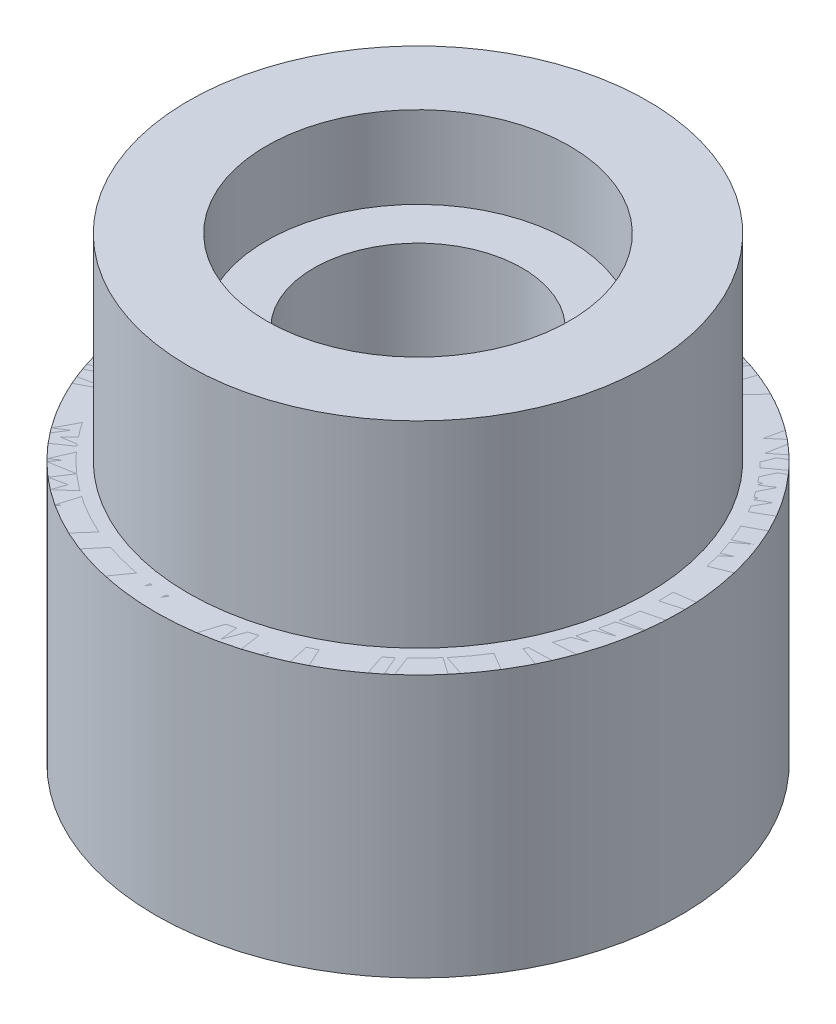
ISO-10303-21;
HEADER;
FILE_DESCRIPTION(('STEP AP214'),'2;1');
FILE_NAME('part.step','',(''),(''),'','','');
FILE_SCHEMA(('AUTOMOTIVE_DESIGN { 1 0 10303 214 1 1 1 1 }'));
ENDSEC;
DATA;
#1=APPLICATION_CONTEXT('core data for automotive mechanical design processes');
#2=APPLICATION_PROTOCOL_DEFINITION('international standard','automotive_design',2000,#1);
#3=PRODUCT_CONTEXT('',#1,'mechanical');
#4=PRODUCT('Part','Part','',(#3));
#5=PRODUCT_RELATED_PRODUCT_CATEGORY('part','',(#4));
#6=PRODUCT_DEFINITION_FORMATION('','',#4);
#7=PRODUCT_DEFINITION_CONTEXT('part definition',#1,'design');
#8=PRODUCT_DEFINITION('design','',#6,#7);
#9=PRODUCT_DEFINITION_SHAPE('','',#8);
#10=(LENGTH_UNIT() NAMED_UNIT(*) SI_UNIT(.MILLI.,.METRE.));
#11=(NAMED_UNIT(*) PLANE_ANGLE_UNIT() SI_UNIT($,.RADIAN.));
#12=(NAMED_UNIT(*) SI_UNIT($,.STERADIAN.) SOLID_ANGLE_UNIT());
#13=UNCERTAINTY_MEASURE_WITH_UNIT(LENGTH_MEASURE(1.E-05),#10,'distance_accuracy_value','');
#14=(GEOMETRIC_REPRESENTATION_CONTEXT(3) GLOBAL_UNCERTAINTY_ASSIGNED_CONTEXT((#13)) GLOBAL_UNIT_ASSIGNED_CONTEXT((#10,
#11,#12)) REPRESENTATION_CONTEXT('',''));
#15=CARTESIAN_POINT('',(0.,0.,0.));
#16=DIRECTION('',(0.,0.,1.));
#17=DIRECTION('',(1.,0.,0.));
#18=AXIS2_PLACEMENT_3D('',#15,#16,#17);
#19=CARTESIAN_POINT('',(0.,0.,0.));
#20=DIRECTION('',(0.,-1.,0.));
#21=DIRECTION('',(0.,0.,-1.));
#22=AXIS2_PLACEMENT_3D('',#19,#20,#21);
#23=CYLINDRICAL_SURFACE('',#22,7.375);
#24=CARTESIAN_POINT('',(0.,8.,0.));
#25=DIRECTION('',(0.,-1.,0.));
#26=DIRECTION('',(0.,0.,-1.));
#27=AXIS2_PLACEMENT_3D('',#24,#25,#26);
#28=CIRCLE('',#27,7.375);
#29=CARTESIAN_POINT('',(0.,8.,-7.375));
#30=VERTEX_POINT('',#29);
#31=EDGE_CURVE('P0_E21',#30,#30,#28,.T.);
#32=ORIENTED_EDGE('',*,*,#31,.T.);
#33=EDGE_LOOP('',(#32));
#34=FACE_BOUND('',#33,.T.);
#35=CARTESIAN_POINT('',(0.,0.,0.));
#36=DIRECTION('',(0.,-1.,0.));
#37=DIRECTION('',(0.,0.,-1.));
#38=AXIS2_PLACEMENT_3D('',#35,#36,#37);
#39=CIRCLE('',#38,7.375);
#40=CARTESIAN_POINT('',(0.,0.,-7.375));
#41=VERTEX_POINT('',#40);
#42=EDGE_CURVE('P0_E11',#41,#41,#39,.F.);
#43=ORIENTED_EDGE('',*,*,#42,.T.);
#44=EDGE_LOOP('',(#43));
#45=FACE_BOUND('',#44,.T.);
#46=ADVANCED_FACE('P0_F17',(#34,#45),#23,.T.);
#47=CARTESIAN_POINT('',(0.,8.,0.));
#48=DIRECTION('',(0.,-1.,0.));
#49=DIRECTION('',(0.,0.,-1.));
#50=AXIS2_PLACEMENT_3D('',#47,#48,#49);
#51=PLANE('',#50);
#52=ORIENTED_EDGE('',*,*,#31,.F.);
#53=EDGE_LOOP('',(#52));
#54=FACE_BOUND('',#53,.T.);
#55=CARTESIAN_POINT('',(-8.,8.,0.));
#56=CARTESIAN_POINT('',(-7.99990265013749,8.,-0.734238479496044));
#57=CARTESIAN_POINT('',(-7.8664429473326,8.,-1.45570441929716));
#58=CARTESIAN_POINT('',(-7.72495795081887,8.,-2.22055406179003));
#59=CARTESIAN_POINT('',(-7.43830640849944,8.,-2.94475767649498));
#60=CARTESIAN_POINT('',(-7.14001112713963,8.,-3.69837832427605));
#61=CARTESIAN_POINT('',(-6.69596408974921,8.,-4.37767802708114));
#62=CARTESIAN_POINT('',(-6.24297994954599,8.,-5.07064964023238));
#63=CARTESIAN_POINT('',(-5.65685424949238,8.,-5.65685424949238));
#64=CARTESIAN_POINT('',(-5.07148593780608,8.,-6.24230136841904));
#65=CARTESIAN_POINT('',(-4.37767802708114,8.,-6.69596408974921));
#66=CARTESIAN_POINT('',(-3.69931538180431,8.,-7.1395275587553));
#67=CARTESIAN_POINT('',(-2.94475767649498,8.,-7.43830640849944));
#68=CARTESIAN_POINT('',(-2.22156295997012,8.,-7.72466659543274));
#69=CARTESIAN_POINT('',(-1.45570441929716,8.,-7.8664429473326));
#70=CARTESIAN_POINT('',(-0.734508562176014,8.,-7.99995130716374));
#71=CARTESIAN_POINT('',(0.,8.,-8.));
#72=CARTESIAN_POINT('',(0.733449371100174,8.,-8.00004862261922));
#73=CARTESIAN_POINT('',(1.45570441929716,8.,-7.86644294733259));
#74=CARTESIAN_POINT('',(2.22055406180139,8.,-7.72495795081425));
#75=CARTESIAN_POINT('',(2.94475767649498,8.,-7.43830640849944));
#76=CARTESIAN_POINT('',(3.69837832427386,8.,-7.14001112714063));
#77=CARTESIAN_POINT('',(4.37767802708114,8.,-6.69596408974921));
#78=CARTESIAN_POINT('',(5.07064964023111,8.,-6.24297994954726));
#79=CARTESIAN_POINT('',(5.65685424949238,8.,-5.65685424949238));
#80=CARTESIAN_POINT('',(6.24230136841836,8.,-5.07148593780675));
#81=CARTESIAN_POINT('',(6.69596408974921,8.,-4.37767802708114));
#82=CARTESIAN_POINT('',(7.13952755875318,8.,-3.6993153818079));
#83=CARTESIAN_POINT('',(7.43830640849944,8.,-2.94475767649498));
#84=CARTESIAN_POINT('',(7.72466659543293,8.,-2.22156295997131));
#85=CARTESIAN_POINT('',(7.8664429473326,8.,-1.45570441929716));
#86=CARTESIAN_POINT('',(7.99990257942877,8.,-0.734771783448102));
#87=CARTESIAN_POINT('',(8.,8.,0.));
#88=B_SPLINE_CURVE_WITH_KNOTS('',2,(#55,#56,#57,#58,#59,#60,#61,#62,#63,#64,#65,#66,#67,#68,#69,
#70,#71,#72,#73,#74,#75,#76,#77,#78,#79,#80,#81,#82,#83,#84,#85,#86,#87),.UNSPECIFIED.,.F.,.F.,
(3,2,2,2,2,2,2,2,2,2,2,2,2,2,2,2,3),(0.,0.0625,0.125,0.1875,0.25,0.3125,0.375,0.4375,0.5,0.5625,
0.625,0.6875,0.75,0.8125,0.875,0.9375,1.),.UNSPECIFIED.);
#89=CARTESIAN_POINT('',(-8.,8.,0.));
#90=VERTEX_POINT('',#89);
#91=CARTESIAN_POINT('',(8.,8.,0.));
#92=VERTEX_POINT('',#91);
#93=EDGE_CURVE('P0_E31',#90,#92,#88,.T.);
#94=ORIENTED_EDGE('',*,*,#93,.T.);
#95=CARTESIAN_POINT('',(8.,8.,0.));
#96=CARTESIAN_POINT('',(7.99990265013749,8.,0.734238479496044));
#97=CARTESIAN_POINT('',(7.8664429473326,8.,1.45570441929716));
#98=CARTESIAN_POINT('',(7.72495795081887,8.,2.22055406179003));
#99=CARTESIAN_POINT('',(7.43830640849944,8.,2.94475767649498));
#100=CARTESIAN_POINT('',(7.14001112713963,8.,3.69837832427605));
#101=CARTESIAN_POINT('',(6.69596408974921,8.,4.37767802708114));
#102=CARTESIAN_POINT('',(6.24297994954599,8.,5.07064964023238));
#103=CARTESIAN_POINT('',(5.65685424949238,8.,5.65685424949238));
#104=CARTESIAN_POINT('',(5.07148593780608,8.,6.24230136841904));
#105=CARTESIAN_POINT('',(4.37767802708114,8.,6.69596408974921));
#106=CARTESIAN_POINT('',(3.69931538180431,8.,7.1395275587553));
#107=CARTESIAN_POINT('',(2.94475767649498,8.,7.43830640849944));
#108=CARTESIAN_POINT('',(2.22156295997012,8.,7.72466659543274));
#109=CARTESIAN_POINT('',(1.45570441929716,8.,7.8664429473326));
#110=CARTESIAN_POINT('',(0.734508562176014,8.,7.99995130716374));
#111=CARTESIAN_POINT('',(0.,8.,8.));
#112=CARTESIAN_POINT('',(-0.733449371100174,8.,8.00004862261922));
#113=CARTESIAN_POINT('',(-1.45570441929716,8.,7.86644294733259));
#114=CARTESIAN_POINT('',(-2.22055406180139,8.,7.72495795081425));
#115=CARTESIAN_POINT('',(-2.94475767649498,8.,7.43830640849944));
#116=CARTESIAN_POINT('',(-3.69837832427386,8.,7.14001112714063));
#117=CARTESIAN_POINT('',(-4.37767802708114,8.,6.69596408974921));
#118=CARTESIAN_POINT('',(-5.07064964023111,8.,6.24297994954726));
#119=CARTESIAN_POINT('',(-5.65685424949238,8.,5.65685424949238));
#120=CARTESIAN_POINT('',(-6.24230136841836,8.,5.07148593780675));
#121=CARTESIAN_POINT('',(-6.69596408974921,8.,4.37767802708114));
#122=CARTESIAN_POINT('',(-7.13952755875318,8.,3.6993153818079));
#123=CARTESIAN_POINT('',(-7.43830640849944,8.,2.94475767649498));
#124=CARTESIAN_POINT('',(-7.72466659543293,8.,2.22156295997131));
#125=CARTESIAN_POINT('',(-7.8664429473326,8.,1.45570441929716));
#126=CARTESIAN_POINT('',(-7.99990257942877,8.,0.734771783448102));
#127=CARTESIAN_POINT('',(-8.,8.,0.));
#128=B_SPLINE_CURVE_WITH_KNOTS('',2,(#95,#96,#97,#98,#99,#100,#101,#102,#103,#104,#105,#106,
#107,#108,#109,#110,#111,#112,#113,#114,#115,#116,#117,#118,#119,#120,#121,#122,#123,#124,#125,
#126,#127),.UNSPECIFIED.,.F.,.F.,(3,2,2,2,2,2,2,2,2,2,2,2,2,2,2,2,3),(0.,0.0625,0.125,0.1875,
0.25,0.3125,0.375,0.4375,0.5,0.5625,0.625,0.6875,0.75,0.8125,0.875,0.9375,1.),.UNSPECIFIED.);
#129=EDGE_CURVE('P0_E34',#92,#90,#128,.T.);
#130=ORIENTED_EDGE('',*,*,#129,.T.);
#131=EDGE_LOOP('',(#94,#130));
#132=FACE_BOUND('',#131,.T.);
#133=ADVANCED_FACE('P0_F18',(#54,#132),#51,.T.);
#134=OPEN_SHELL('',(#46,#133));
#135=SHELL_BASED_SURFACE_MODEL('P0_B1',(#134));
#136=CARTESIAN_POINT('',(0.,11.5,0.));
#137=DIRECTION('',(0.,1.,0.));
#138=DIRECTION('',(0.,0.,1.));
#139=AXIS2_PLACEMENT_3D('',#136,#137,#138);
#140=PLANE('',#139);
#141=CARTESIAN_POINT('',(0.,11.5,0.));
#142=DIRECTION('',(0.,1.,0.));
#143=DIRECTION('',(0.,0.,1.));
#144=AXIS2_PLACEMENT_3D('',#141,#142,#143);
#145=CIRCLE('',#144,3.175);
#146=CARTESIAN_POINT('',(0.,11.5,3.175));
#147=VERTEX_POINT('',#146);
#148=EDGE_CURVE('P1_E20',#147,#147,#145,.F.);
#149=ORIENTED_EDGE('',*,*,#148,.T.);
#150=EDGE_LOOP('',(#149));
#151=FACE_BOUND('',#150,.T.);
#152=CARTESIAN_POINT('',(0.,11.5,0.));
#153=DIRECTION('',(0.,1.,0.));
#154=DIRECTION('',(0.,0.,1.));
#155=AXIS2_PLACEMENT_3D('',#152,#153,#154);
#156=CIRCLE('',#155,4.62);
#157=CARTESIAN_POINT('',(0.,11.5,4.62));
#158=VERTEX_POINT('',#157);
#159=EDGE_CURVE('P1_E112',#158,#158,#156,.T.);
#160=ORIENTED_EDGE('',*,*,#159,.T.);
#161=EDGE_LOOP('',(#160));
#162=FACE_BOUND('',#161,.T.);
#163=ADVANCED_FACE('P1_F17',(#151,#162),#140,.T.);
#164=CARTESIAN_POINT('',(0.,0.,0.));
#165=DIRECTION('',(0.,1.,0.));
#166=DIRECTION('',(0.,0.,1.));
#167=AXIS2_PLACEMENT_3D('',#164,#165,#166);
#168=CYLINDRICAL_SURFACE('',#167,3.175);
#169=CARTESIAN_POINT('',(0.,4.,0.));
#170=DIRECTION('',(0.,1.,0.));
#171=DIRECTION('',(0.,0.,1.));
#172=AXIS2_PLACEMENT_3D('',#169,#170,#171);
#173=CIRCLE('',#172,3.175);
#174=CARTESIAN_POINT('',(0.,4.,3.175));
#175=VERTEX_POINT('',#174);
#176=EDGE_CURVE('P1_E110',#175,#175,#173,.T.);
#177=ORIENTED_EDGE('',*,*,#176,.F.);
#178=EDGE_LOOP('',(#177));
#179=FACE_BOUND('',#178,.T.);
#180=ORIENTED_EDGE('',*,*,#148,.F.);
#181=EDGE_LOOP('',(#180));
#182=FACE_BOUND('',#181,.T.);
#183=ADVANCED_FACE('P1_F120',(#179,#182),#168,.F.);
#184=CARTESIAN_POINT('',(0.,14.,0.));
#185=DIRECTION('',(0.,1.,0.));
#186=DIRECTION('',(0.,0.,1.));
#187=AXIS2_PLACEMENT_3D('',#184,#185,#186);
#188=CYLINDRICAL_SURFACE('',#187,4.62);
#189=ORIENTED_EDGE('',*,*,#159,.F.);
#190=EDGE_LOOP('',(#189));
#191=FACE_BOUND('',#190,.T.);
#192=CARTESIAN_POINT('',(0.,14.,0.));
#193=DIRECTION('',(0.,1.,0.));
#194=DIRECTION('',(0.,0.,1.));
#195=AXIS2_PLACEMENT_3D('',#192,#193,#194);
#196=CIRCLE('',#195,4.62);
#197=CARTESIAN_POINT('',(0.,14.,4.62));
#198=VERTEX_POINT('',#197);
#199=EDGE_CURVE('P1_E90',#198,#198,#196,.F.);
#200=ORIENTED_EDGE('',*,*,#199,.F.);
#201=EDGE_LOOP('',(#200));
#202=FACE_BOUND('',#201,.T.);
#203=ADVANCED_FACE('P1_F46',(#191,#202),#188,.F.);
#204=CARTESIAN_POINT('',(0.,4.,0.));
#205=DIRECTION('',(0.,-1.,0.));
#206=DIRECTION('',(0.,0.,-1.));
#207=AXIS2_PLACEMENT_3D('',#204,#205,#206);
#208=PLANE('',#207);
#209=ORIENTED_EDGE('',*,*,#176,.T.);
#210=EDGE_LOOP('',(#209));
#211=FACE_BOUND('',#210,.T.);
#212=CARTESIAN_POINT('',(0.,4.,0.));
#213=DIRECTION('',(0.,-1.,0.));
#214=DIRECTION('',(0.,0.,-1.));
#215=AXIS2_PLACEMENT_3D('',#212,#213,#214);
#216=CIRCLE('',#215,3.5);
#217=CARTESIAN_POINT('',(0.,4.,-3.5));
#218=VERTEX_POINT('',#217);
#219=EDGE_CURVE('P1_E106',#218,#218,#216,.T.);
#220=ORIENTED_EDGE('',*,*,#219,.T.);
#221=EDGE_LOOP('',(#220));
#222=FACE_BOUND('',#221,.T.);
#223=ADVANCED_FACE('P1_F35',(#211,#222),#208,.T.);
#224=CARTESIAN_POINT('',(0.,2.00000000006639,-5.8));
#225=DIRECTION('',(0.,-1.,0.));
#226=DIRECTION('',(0.,0.,-1.));
#227=AXIS2_PLACEMENT_3D('',#224,#225,#226);
#228=CONICAL_SURFACE('',#227,0.99999999991951,1.02974425848627);
#229=CARTESIAN_POINT('',(0.,2.,-5.8));
#230=DIRECTION('',(0.,-1.,0.));
#231=DIRECTION('',(0.,0.,-1.));
#232=AXIS2_PLACEMENT_3D('',#229,#230,#231);
#233=CIRCLE('',#232,1.);
#234=CARTESIAN_POINT('',(0.,2.,-6.8));
#235=VERTEX_POINT('',#234);
#236=EDGE_CURVE('P1_E102',#235,#235,#233,.T.);
#237=ORIENTED_EDGE('',*,*,#236,.T.);
#238=EDGE_LOOP('',(#237));
#239=FACE_BOUND('',#238,.T.);
#240=CARTESIAN_POINT('',(5.6843418860808E-11,2.60086061913967,-5.8));
#241=VERTEX_POINT('',#240);
#242=VERTEX_LOOP('',#241);
#243=FACE_BOUND('',#242,.T.);
#244=ADVANCED_FACE('P1_F32',(#239,#243),#228,.F.);
#245=CARTESIAN_POINT('',(0.,2.00000000006639,5.8));
#246=DIRECTION('',(0.,-1.,0.));
#247=DIRECTION('',(0.,0.,-1.));
#248=AXIS2_PLACEMENT_3D('',#245,#246,#247);
#249=CONICAL_SURFACE('',#248,0.99999999991951,1.02974425848627);
#250=CARTESIAN_POINT('',(0.,2.,5.8));
#251=DIRECTION('',(0.,-1.,0.));
#252=DIRECTION('',(0.,0.,-1.));
#253=AXIS2_PLACEMENT_3D('',#250,#251,#252);
#254=CIRCLE('',#253,1.);
#255=CARTESIAN_POINT('',(0.,2.,4.8));
#256=VERTEX_POINT('',#255);
#257=EDGE_CURVE('P1_E96',#256,#256,#254,.T.);
#258=ORIENTED_EDGE('',*,*,#257,.T.);
#259=EDGE_LOOP('',(#258));
#260=FACE_BOUND('',#259,.T.);
#261=CARTESIAN_POINT('',(-5.6843418860808E-11,2.60086061913967,5.8));
#262=VERTEX_POINT('',#261);
#263=VERTEX_LOOP('',#262);
#264=FACE_BOUND('',#263,.T.);
#265=ADVANCED_FACE('P1_F34',(#260,#264),#249,.F.);
#266=CARTESIAN_POINT('',(0.,14.,0.));
#267=DIRECTION('',(0.,1.,0.));
#268=DIRECTION('',(0.,0.,1.));
#269=AXIS2_PLACEMENT_3D('',#266,#267,#268);
#270=PLANE('',#269);
#271=ORIENTED_EDGE('',*,*,#199,.T.);
#272=EDGE_LOOP('',(#271));
#273=FACE_BOUND('',#272,.T.);
#274=CARTESIAN_POINT('',(0.,14.,0.));
#275=DIRECTION('',(0.,1.,0.));
#276=DIRECTION('',(0.,0.,1.));
#277=AXIS2_PLACEMENT_3D('',#274,#275,#276);
#278=CIRCLE('',#277,7.);
#279=CARTESIAN_POINT('',(0.,14.,7.));
#280=VERTEX_POINT('',#279);
#281=EDGE_CURVE('P1_E93',#280,#280,#278,.F.);
#282=ORIENTED_EDGE('',*,*,#281,.F.);
#283=EDGE_LOOP('',(#282));
#284=FACE_BOUND('',#283,.T.);
#285=ADVANCED_FACE('P1_F43',(#273,#284),#270,.T.);
#286=CARTESIAN_POINT('',(0.,0.,0.));
#287=DIRECTION('',(0.,-1.,0.));
#288=DIRECTION('',(0.,0.,-1.));
#289=AXIS2_PLACEMENT_3D('',#286,#287,#288);
#290=CYLINDRICAL_SURFACE('',#289,3.5);
#291=ORIENTED_EDGE('',*,*,#219,.F.);
#292=EDGE_LOOP('',(#291));
#293=FACE_BOUND('',#292,.T.);
#294=CARTESIAN_POINT('',(0.,0.,0.));
#295=DIRECTION('',(0.,-1.,0.));
#296=DIRECTION('',(0.,0.,-1.));
#297=AXIS2_PLACEMENT_3D('',#294,#295,#296);
#298=CIRCLE('',#297,3.5);
#299=CARTESIAN_POINT('',(0.,0.,-3.5));
#300=VERTEX_POINT('',#299);
#301=EDGE_CURVE('P1_E95',#300,#300,#298,.T.);
#302=ORIENTED_EDGE('',*,*,#301,.T.);
#303=EDGE_LOOP('',(#302));
#304=FACE_BOUND('',#303,.T.);
#305=ADVANCED_FACE('P1_F78',(#293,#304),#290,.F.);
#306=CARTESIAN_POINT('',(0.,2.730903649979,-5.8));
#307=DIRECTION('',(0.,-1.,0.));
#308=DIRECTION('',(0.,0.,-1.));
#309=AXIS2_PLACEMENT_3D('',#306,#307,#308);
#310=CYLINDRICAL_SURFACE('',#309,1.);
#311=ORIENTED_EDGE('',*,*,#236,.F.);
#312=EDGE_LOOP('',(#311));
#313=FACE_BOUND('',#312,.T.);
#314=CARTESIAN_POINT('',(0.,0.,-5.8));
#315=DIRECTION('',(0.,-1.,0.));
#316=DIRECTION('',(0.,0.,-1.));
#317=AXIS2_PLACEMENT_3D('',#314,#315,#316);
#318=CIRCLE('',#317,1.);
#319=CARTESIAN_POINT('',(0.,0.,-6.8));
#320=VERTEX_POINT('',#319);
#321=EDGE_CURVE('P1_E99',#320,#320,#318,.T.);
#322=ORIENTED_EDGE('',*,*,#321,.T.);
#323=EDGE_LOOP('',(#322));
#324=FACE_BOUND('',#323,.T.);
#325=ADVANCED_FACE('P1_F74',(#313,#324),#310,.F.);
#326=CARTESIAN_POINT('',(0.,2.730903649979,5.8));
#327=DIRECTION('',(0.,-1.,0.));
#328=DIRECTION('',(0.,0.,-1.));
#329=AXIS2_PLACEMENT_3D('',#326,#327,#328);
#330=CYLINDRICAL_SURFACE('',#329,1.);
#331=ORIENTED_EDGE('',*,*,#257,.F.);
#332=EDGE_LOOP('',(#331));
#333=FACE_BOUND('',#332,.T.);
#334=CARTESIAN_POINT('',(0.,0.,5.8));
#335=DIRECTION('',(0.,-1.,0.));
#336=DIRECTION('',(0.,0.,-1.));
#337=AXIS2_PLACEMENT_3D('',#334,#335,#336);
#338=CIRCLE('',#337,1.);
#339=CARTESIAN_POINT('',(0.,0.,4.8));
#340=VERTEX_POINT('',#339);
#341=EDGE_CURVE('P1_E140',#340,#340,#338,.T.);
#342=ORIENTED_EDGE('',*,*,#341,.T.);
#343=EDGE_LOOP('',(#342));
#344=FACE_BOUND('',#343,.T.);
#345=ADVANCED_FACE('P1_F70',(#333,#344),#330,.F.);
#346=CARTESIAN_POINT('',(0.,14.,0.));
#347=DIRECTION('',(0.,1.,0.));
#348=DIRECTION('',(0.,0.,1.));
#349=AXIS2_PLACEMENT_3D('',#346,#347,#348);
#350=CYLINDRICAL_SURFACE('',#349,7.);
#351=CARTESIAN_POINT('',(0.,8.,0.));
#352=DIRECTION('',(0.,1.,0.));
#353=DIRECTION('',(0.,0.,1.));
#354=AXIS2_PLACEMENT_3D('',#351,#352,#353);
#355=CIRCLE('',#354,7.);
#356=CARTESIAN_POINT('',(0.,8.,7.));
#357=VERTEX_POINT('',#356);
#358=EDGE_CURVE('P1_E137',#357,#357,#355,.F.);
#359=ORIENTED_EDGE('',*,*,#358,.F.);
#360=EDGE_LOOP('',(#359));
#361=FACE_BOUND('',#360,.T.);
#362=ORIENTED_EDGE('',*,*,#281,.T.);
#363=EDGE_LOOP('',(#362));
#364=FACE_BOUND('',#363,.T.);
#365=ADVANCED_FACE('P1_F66',(#361,#364),#350,.T.);
#366=CARTESIAN_POINT('',(0.,0.,0.));
#367=DIRECTION('',(0.,1.,0.));
#368=DIRECTION('',(0.,0.,1.));
#369=AXIS2_PLACEMENT_3D('',#366,#367,#368);
#370=PLANE('',#369);
#371=ORIENTED_EDGE('',*,*,#341,.F.);
#372=EDGE_LOOP('',(#371));
#373=FACE_BOUND('',#372,.T.);
#374=ORIENTED_EDGE('',*,*,#321,.F.);
#375=EDGE_LOOP('',(#374));
#376=FACE_BOUND('',#375,.T.);
#377=ORIENTED_EDGE('',*,*,#301,.F.);
#378=EDGE_LOOP('',(#377));
#379=FACE_BOUND('',#378,.T.);
#380=CARTESIAN_POINT('',(0.,0.,0.));
#381=DIRECTION('',(0.,1.,0.));
#382=DIRECTION('',(0.,0.,1.));
#383=AXIS2_PLACEMENT_3D('',#380,#381,#382);
#384=CIRCLE('',#383,8.);
#385=CARTESIAN_POINT('',(0.,0.,8.));
#386=VERTEX_POINT('',#385);
#387=EDGE_CURVE('P1_E26',#386,#386,#384,.T.);
#388=ORIENTED_EDGE('',*,*,#387,.F.);
#389=EDGE_LOOP('',(#388));
#390=FACE_BOUND('',#389,.T.);
#391=ADVANCED_FACE('P1_F58',(#373,#376,#379,#390),#370,.F.);
#392=CARTESIAN_POINT('',(0.,8.,0.));
#393=DIRECTION('',(0.,1.,0.));
#394=DIRECTION('',(0.,0.,1.));
#395=AXIS2_PLACEMENT_3D('',#392,#393,#394);
#396=PLANE('',#395);
#397=ORIENTED_EDGE('',*,*,#358,.T.);
#398=EDGE_LOOP('',(#397));
#399=FACE_BOUND('',#398,.T.);
#400=CARTESIAN_POINT('',(0.,8.,0.));
#401=DIRECTION('',(0.,1.,0.));
#402=DIRECTION('',(0.,0.,1.));
#403=AXIS2_PLACEMENT_3D('',#400,#401,#402);
#404=CIRCLE('',#403,8.);
#405=CARTESIAN_POINT('',(0.,8.,8.));
#406=VERTEX_POINT('',#405);
#407=EDGE_CURVE('P1_E11',#406,#406,#404,.F.);
#408=ORIENTED_EDGE('',*,*,#407,.F.);
#409=EDGE_LOOP('',(#408));
#410=FACE_BOUND('',#409,.T.);
#411=ADVANCED_FACE('P1_F52',(#399,#410),#396,.T.);
#412=CARTESIAN_POINT('',(0.,0.,0.));
#413=DIRECTION('',(0.,1.,0.));
#414=DIRECTION('',(0.,0.,1.));
#415=AXIS2_PLACEMENT_3D('',#412,#413,#414);
#416=CYLINDRICAL_SURFACE('',#415,8.);
#417=ORIENTED_EDGE('',*,*,#387,.T.);
#418=EDGE_LOOP('',(#417));
#419=FACE_BOUND('',#418,.T.);
#420=ORIENTED_EDGE('',*,*,#407,.T.);
#421=EDGE_LOOP('',(#420));
#422=FACE_BOUND('',#421,.T.);
#423=ADVANCED_FACE('P1_F50',(#419,#422),#416,.T.);
#424=CLOSED_SHELL('',(#163,#183,#203,#223,#244,#265,#285,#305,#325,#345,#365,#391,#411,#423));
#425=MANIFOLD_SOLID_BREP('P1_B1',#424);
#426=ADVANCED_BREP_SHAPE_REPRESENTATION('',(#18,#425),#14);
#427=MANIFOLD_SURFACE_SHAPE_REPRESENTATION('',(#18,#135),#14);
#428=SHAPE_REPRESENTATION('',(#18),#14);
#429=SHAPE_DEFINITION_REPRESENTATION(#9,#428);
#430=SHAPE_REPRESENTATION_RELATIONSHIP('','',#428,#426);
#431=SHAPE_REPRESENTATION_RELATIONSHIP('','',#428,#427);
ENDSEC;
END-ISO-10303-21;
